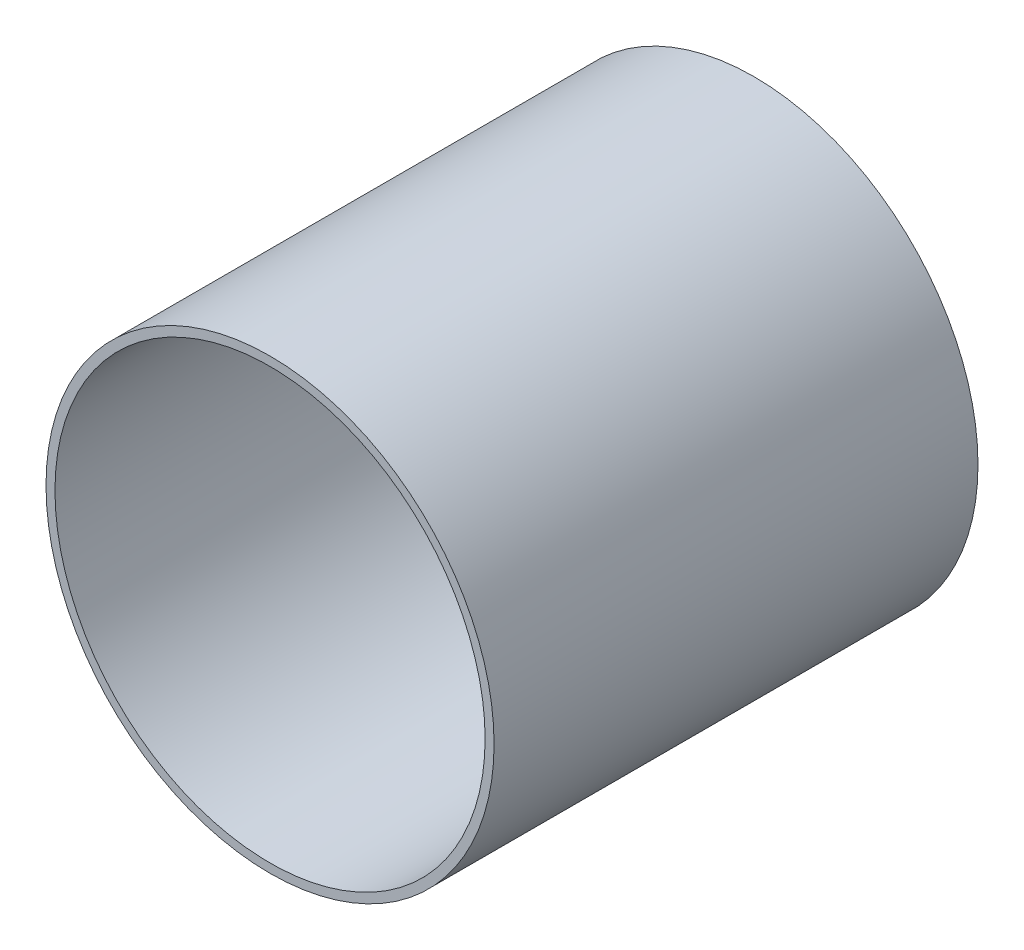
ISO-10303-21;
HEADER;
FILE_DESCRIPTION(('STEP AP214'),'2;1');
FILE_NAME('part.step','',(''),(''),'','','');
FILE_SCHEMA(('AUTOMOTIVE_DESIGN { 1 0 10303 214 1 1 1 1 }'));
ENDSEC;
DATA;
#1=APPLICATION_CONTEXT('core data for automotive mechanical design processes');
#2=APPLICATION_PROTOCOL_DEFINITION('international standard','automotive_design',2000,#1);
#3=PRODUCT_CONTEXT('',#1,'mechanical');
#4=PRODUCT('Part','Part','',(#3));
#5=PRODUCT_RELATED_PRODUCT_CATEGORY('part','',(#4));
#6=PRODUCT_DEFINITION_FORMATION('','',#4);
#7=PRODUCT_DEFINITION_CONTEXT('part definition',#1,'design');
#8=PRODUCT_DEFINITION('design','',#6,#7);
#9=PRODUCT_DEFINITION_SHAPE('','',#8);
#10=(LENGTH_UNIT() NAMED_UNIT(*) SI_UNIT(.MILLI.,.METRE.));
#11=(NAMED_UNIT(*) PLANE_ANGLE_UNIT() SI_UNIT($,.RADIAN.));
#12=(NAMED_UNIT(*) SI_UNIT($,.STERADIAN.) SOLID_ANGLE_UNIT());
#13=UNCERTAINTY_MEASURE_WITH_UNIT(LENGTH_MEASURE(1.E-05),#10,'distance_accuracy_value','');
#14=(GEOMETRIC_REPRESENTATION_CONTEXT(3) GLOBAL_UNCERTAINTY_ASSIGNED_CONTEXT((#13)) GLOBAL_UNIT_ASSIGNED_CONTEXT((#10,
#11,#12)) REPRESENTATION_CONTEXT('',''));
#15=CARTESIAN_POINT('',(0.,0.,0.));
#16=DIRECTION('',(0.,0.,1.));
#17=DIRECTION('',(1.,0.,0.));
#18=AXIS2_PLACEMENT_3D('',#15,#16,#17);
#19=CARTESIAN_POINT('',(0.,0.,54.));
#20=DIRECTION('',(0.,0.,1.));
#21=DIRECTION('',(1.,0.,0.));
#22=AXIS2_PLACEMENT_3D('',#19,#20,#21);
#23=PLANE('',#22);
#24=CARTESIAN_POINT('',(0.,0.,54.));
#25=DIRECTION('',(0.,0.,1.));
#26=DIRECTION('',(1.,0.,0.));
#27=AXIS2_PLACEMENT_3D('',#24,#25,#26);
#28=CIRCLE('',#27,25.);
#29=CARTESIAN_POINT('',(25.,0.,54.));
#30=VERTEX_POINT('',#29);
#31=EDGE_CURVE('E10',#30,#30,#28,.T.);
#32=ORIENTED_EDGE('',*,*,#31,.T.);
#33=EDGE_LOOP('',(#32));
#34=FACE_BOUND('',#33,.T.);
#35=CARTESIAN_POINT('',(0.,0.,54.));
#36=DIRECTION('',(0.,0.,1.));
#37=DIRECTION('',(1.,0.,0.));
#38=AXIS2_PLACEMENT_3D('',#35,#36,#37);
#39=CIRCLE('',#38,24.);
#40=CARTESIAN_POINT('',(24.,0.,54.));
#41=VERTEX_POINT('',#40);
#42=EDGE_CURVE('E50',#41,#41,#39,.T.);
#43=ORIENTED_EDGE('',*,*,#42,.F.);
#44=EDGE_LOOP('',(#43));
#45=FACE_BOUND('',#44,.T.);
#46=ADVANCED_FACE('F37',(#34,#45),#23,.T.);
#47=CARTESIAN_POINT('',(0.,0.,0.));
#48=DIRECTION('',(0.,0.,1.));
#49=DIRECTION('',(1.,0.,0.));
#50=AXIS2_PLACEMENT_3D('',#47,#48,#49);
#51=PLANE('',#50);
#52=CARTESIAN_POINT('',(0.,0.,0.));
#53=DIRECTION('',(0.,0.,1.));
#54=DIRECTION('',(1.,0.,0.));
#55=AXIS2_PLACEMENT_3D('',#52,#53,#54);
#56=CIRCLE('',#55,25.);
#57=CARTESIAN_POINT('',(25.,0.,0.));
#58=VERTEX_POINT('',#57);
#59=EDGE_CURVE('E41',#58,#58,#56,.T.);
#60=ORIENTED_EDGE('',*,*,#59,.F.);
#61=EDGE_LOOP('',(#60));
#62=FACE_BOUND('',#61,.T.);
#63=CARTESIAN_POINT('',(0.,0.,0.));
#64=DIRECTION('',(0.,0.,1.));
#65=DIRECTION('',(1.,0.,0.));
#66=AXIS2_PLACEMENT_3D('',#63,#64,#65);
#67=CIRCLE('',#66,24.);
#68=CARTESIAN_POINT('',(24.,0.,0.));
#69=VERTEX_POINT('',#68);
#70=EDGE_CURVE('E52',#69,#69,#67,.T.);
#71=ORIENTED_EDGE('',*,*,#70,.T.);
#72=EDGE_LOOP('',(#71));
#73=FACE_BOUND('',#72,.T.);
#74=ADVANCED_FACE('F64',(#62,#73),#51,.F.);
#75=CARTESIAN_POINT('',(0.,0.,54.));
#76=DIRECTION('',(0.,0.,-1.));
#77=DIRECTION('',(-1.,0.,0.));
#78=AXIS2_PLACEMENT_3D('',#75,#76,#77);
#79=CYLINDRICAL_SURFACE('',#78,25.);
#80=ORIENTED_EDGE('',*,*,#31,.F.);
#81=EDGE_LOOP('',(#80));
#82=FACE_BOUND('',#81,.T.);
#83=ORIENTED_EDGE('',*,*,#59,.T.);
#84=EDGE_LOOP('',(#83));
#85=FACE_BOUND('',#84,.T.);
#86=ADVANCED_FACE('F39',(#82,#85),#79,.T.);
#87=CARTESIAN_POINT('',(0.,0.,54.));
#88=DIRECTION('',(0.,0.,-1.));
#89=DIRECTION('',(-1.,0.,0.));
#90=AXIS2_PLACEMENT_3D('',#87,#88,#89);
#91=CYLINDRICAL_SURFACE('',#90,24.);
#92=ORIENTED_EDGE('',*,*,#42,.T.);
#93=EDGE_LOOP('',(#92));
#94=FACE_BOUND('',#93,.T.);
#95=ORIENTED_EDGE('',*,*,#70,.F.);
#96=EDGE_LOOP('',(#95));
#97=FACE_BOUND('',#96,.T.);
#98=ADVANCED_FACE('F60',(#94,#97),#91,.F.);
#99=CLOSED_SHELL('',(#46,#74,#86,#98));
#100=MANIFOLD_SOLID_BREP('B2',#99);
#101=ADVANCED_BREP_SHAPE_REPRESENTATION('',(#18,#100),#14);
#102=SHAPE_DEFINITION_REPRESENTATION(#9,#101);
ENDSEC;
END-ISO-10303-21;
